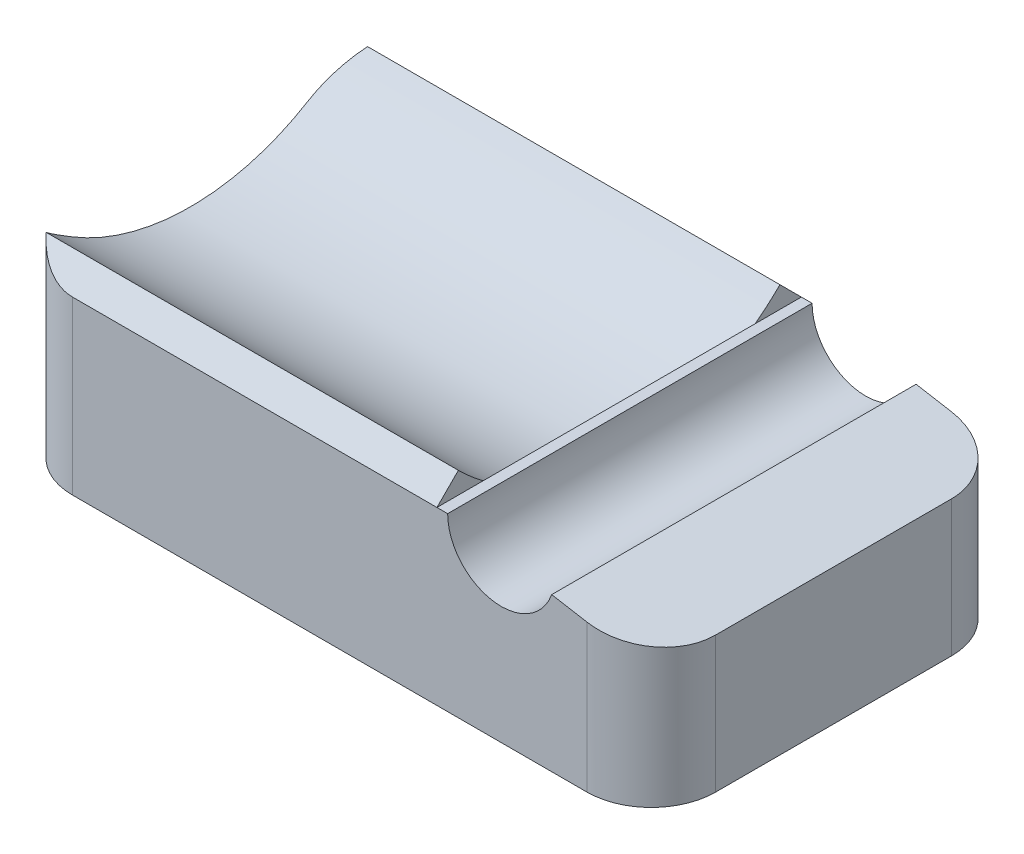
ISO-10303-21;
HEADER;
FILE_DESCRIPTION(('STEP AP214'),'2;1');
FILE_NAME('part.step','',(''),(''),'','','');
FILE_SCHEMA(('AUTOMOTIVE_DESIGN { 1 0 10303 214 1 1 1 1 }'));
ENDSEC;
DATA;
#1=APPLICATION_CONTEXT('core data for automotive mechanical design processes');
#2=APPLICATION_PROTOCOL_DEFINITION('international standard','automotive_design',2000,#1);
#3=PRODUCT_CONTEXT('',#1,'mechanical');
#4=PRODUCT('Part','Part','',(#3));
#5=PRODUCT_RELATED_PRODUCT_CATEGORY('part','',(#4));
#6=PRODUCT_DEFINITION_FORMATION('','',#4);
#7=PRODUCT_DEFINITION_CONTEXT('part definition',#1,'design');
#8=PRODUCT_DEFINITION('design','',#6,#7);
#9=PRODUCT_DEFINITION_SHAPE('','',#8);
#10=(LENGTH_UNIT() NAMED_UNIT(*) SI_UNIT(.MILLI.,.METRE.));
#11=(NAMED_UNIT(*) PLANE_ANGLE_UNIT() SI_UNIT($,.RADIAN.));
#12=(NAMED_UNIT(*) SI_UNIT($,.STERADIAN.) SOLID_ANGLE_UNIT());
#13=UNCERTAINTY_MEASURE_WITH_UNIT(LENGTH_MEASURE(1.E-05),#10,'distance_accuracy_value','');
#14=(GEOMETRIC_REPRESENTATION_CONTEXT(3) GLOBAL_UNCERTAINTY_ASSIGNED_CONTEXT((#13)) GLOBAL_UNIT_ASSIGNED_CONTEXT((#10,
#11,#12)) REPRESENTATION_CONTEXT('',''));
#15=CARTESIAN_POINT('',(0.,0.,0.));
#16=DIRECTION('',(0.,0.,1.));
#17=DIRECTION('',(1.,0.,0.));
#18=AXIS2_PLACEMENT_3D('',#15,#16,#17);
#19=CARTESIAN_POINT('',(0.,16.,0.));
#20=DIRECTION('',(0.,-1.,0.));
#21=DIRECTION('',(0.,0.,-1.));
#22=AXIS2_PLACEMENT_3D('',#19,#20,#21);
#23=PLANE('',#22);
#24=DIRECTION('',(1.,0.,0.));
#25=VECTOR('',#24,1.);
#26=CARTESIAN_POINT('',(0.,16.,0.));
#27=LINE('',#26,#25);
#28=CARTESIAN_POINT('',(40.,16.,0.));
#29=VERTEX_POINT('',#28);
#30=CARTESIAN_POINT('',(41.,16.,0.));
#31=VERTEX_POINT('',#30);
#32=EDGE_CURVE('E323',#29,#31,#27,.T.);
#33=ORIENTED_EDGE('',*,*,#32,.T.);
#34=DIRECTION('',(0.,0.,1.));
#35=VECTOR('',#34,1.);
#36=CARTESIAN_POINT('',(41.,16.,-34.));
#37=LINE('',#36,#35);
#38=CARTESIAN_POINT('',(41.,16.,-34.));
#39=VERTEX_POINT('',#38);
#40=EDGE_CURVE('E373',#31,#39,#37,.F.);
#41=ORIENTED_EDGE('',*,*,#40,.T.);
#42=DIRECTION('',(-1.,0.,0.));
#43=VECTOR('',#42,1.);
#44=CARTESIAN_POINT('',(0.,16.,-34.));
#45=LINE('',#44,#43);
#46=CARTESIAN_POINT('',(40.,16.,-34.));
#47=VERTEX_POINT('',#46);
#48=EDGE_CURVE('E169',#39,#47,#45,.T.);
#49=ORIENTED_EDGE('',*,*,#48,.T.);
#50=DIRECTION('',(0.,0.,1.));
#51=VECTOR('',#50,1.);
#52=CARTESIAN_POINT('',(40.,16.,-34.));
#53=LINE('',#52,#51);
#54=CARTESIAN_POINT('',(40.,16.,-29.6885775404495));
#55=VERTEX_POINT('',#54);
#56=EDGE_CURVE('E313',#47,#55,#53,.T.);
#57=ORIENTED_EDGE('',*,*,#56,.T.);
#58=DIRECTION('',(0.,0.,-1.));
#59=VECTOR('',#58,1.);
#60=CARTESIAN_POINT('',(40.,16.,0.));
#61=LINE('',#60,#59);
#62=CARTESIAN_POINT('',(40.,16.,-4.31142245955048));
#63=VERTEX_POINT('',#62);
#64=EDGE_CURVE('E352',#63,#55,#61,.T.);
#65=ORIENTED_EDGE('',*,*,#64,.F.);
#66=DIRECTION('',(0.,0.,1.));
#67=VECTOR('',#66,1.);
#68=CARTESIAN_POINT('',(40.,16.,0.));
#69=LINE('',#68,#67);
#70=EDGE_CURVE('E341',#63,#29,#69,.T.);
#71=ORIENTED_EDGE('',*,*,#70,.T.);
#72=EDGE_LOOP('',(#33,#41,#49,#57,#65,#71));
#73=FACE_BOUND('',#72,.T.);
#74=ADVANCED_FACE('F45',(#73),#23,.F.);
#75=CARTESIAN_POINT('',(0.,16.,0.));
#76=DIRECTION('',(1.,0.,0.));
#77=DIRECTION('',(0.,0.,-1.));
#78=AXIS2_PLACEMENT_3D('',#75,#76,#77);
#79=PLANE('',#78);
#80=CARTESIAN_POINT('',(0.,33.0000000000001,-17.));
#81=DIRECTION('',(1.,0.,0.));
#82=DIRECTION('',(0.,0.,1.));
#83=AXIS2_PLACEMENT_3D('',#80,#81,#82);
#84=CIRCLE('',#83,21.2132034355965);
#85=CARTESIAN_POINT('',(0.,14.861642852783,-6.));
#86=VERTEX_POINT('',#85);
#87=CARTESIAN_POINT('',(0.,14.861642852783,-28.));
#88=VERTEX_POINT('',#87);
#89=EDGE_CURVE('E303',#86,#88,#84,.T.);
#90=ORIENTED_EDGE('',*,*,#89,.T.);
#91=DIRECTION('',(0.,-1.,0.));
#92=VECTOR('',#91,1.);
#93=CARTESIAN_POINT('',(0.,16.,-28.));
#94=LINE('',#93,#92);
#95=CARTESIAN_POINT('',(0.,0.,-28.));
#96=VERTEX_POINT('',#95);
#97=EDGE_CURVE('E175',#88,#96,#94,.T.);
#98=ORIENTED_EDGE('',*,*,#97,.T.);
#99=DIRECTION('',(0.,0.,1.));
#100=VECTOR('',#99,1.);
#101=CARTESIAN_POINT('',(0.,0.,0.));
#102=LINE('',#101,#100);
#103=CARTESIAN_POINT('',(0.,0.,-6.));
#104=VERTEX_POINT('',#103);
#105=EDGE_CURVE('E319',#96,#104,#102,.T.);
#106=ORIENTED_EDGE('',*,*,#105,.T.);
#107=DIRECTION('',(0.,-1.,0.));
#108=VECTOR('',#107,1.);
#109=CARTESIAN_POINT('',(0.,16.,-6.));
#110=LINE('',#109,#108);
#111=EDGE_CURVE('E171',#104,#86,#110,.F.);
#112=ORIENTED_EDGE('',*,*,#111,.T.);
#113=EDGE_LOOP('',(#90,#98,#106,#112));
#114=FACE_BOUND('',#113,.T.);
#115=ADVANCED_FACE('F242',(#114),#79,.F.);
#116=CARTESIAN_POINT('',(0.,16.,0.));
#117=DIRECTION('',(0.,0.,-1.));
#118=DIRECTION('',(-1.,0.,0.));
#119=AXIS2_PLACEMENT_3D('',#116,#117,#118);
#120=PLANE('',#119);
#121=DIRECTION('',(0.,-1.,0.));
#122=VECTOR('',#121,1.);
#123=CARTESIAN_POINT('',(54.,16.,0.));
#124=LINE('',#123,#122);
#125=CARTESIAN_POINT('',(54.,0.,0.));
#126=VERTEX_POINT('',#125);
#127=CARTESIAN_POINT('',(54.,13.7371143827351,0.));
#128=VERTEX_POINT('',#127);
#129=EDGE_CURVE('E279',#126,#128,#124,.F.);
#130=ORIENTED_EDGE('',*,*,#129,.T.);
#131=DIRECTION('',(0.985185952673768,-0.171489470972069,0.));
#132=VECTOR('',#131,1.);
#133=CARTESIAN_POINT('',(50.7059136134572,14.3105098216686,0.));
#134=LINE('',#133,#132);
#135=CARTESIAN_POINT('',(50.7059136134572,14.3105098216686,0.));
#136=VERTEX_POINT('',#135);
#137=EDGE_CURVE('E61',#136,#128,#134,.T.);
#138=ORIENTED_EDGE('',*,*,#137,.F.);
#139=CARTESIAN_POINT('',(46.,16.,0.));
#140=DIRECTION('',(0.,0.,1.));
#141=DIRECTION('',(1.,0.,0.));
#142=AXIS2_PLACEMENT_3D('',#139,#140,#141);
#143=CIRCLE('',#142,5.);
#144=EDGE_CURVE('E162',#31,#136,#143,.T.);
#145=ORIENTED_EDGE('',*,*,#144,.F.);
#146=ORIENTED_EDGE('',*,*,#32,.F.);
#147=CARTESIAN_POINT('',(6.,16.,0.));
#148=VERTEX_POINT('',#147);
#149=EDGE_CURVE('E177',#148,#29,#27,.T.);
#150=ORIENTED_EDGE('',*,*,#149,.F.);
#151=DIRECTION('',(0.,-1.,0.));
#152=VECTOR('',#151,1.);
#153=CARTESIAN_POINT('',(6.,16.,0.));
#154=LINE('',#153,#152);
#155=CARTESIAN_POINT('',(6.,0.,0.));
#156=VERTEX_POINT('',#155);
#157=EDGE_CURVE('E287',#148,#156,#154,.T.);
#158=ORIENTED_EDGE('',*,*,#157,.T.);
#159=DIRECTION('',(1.,0.,0.));
#160=VECTOR('',#159,1.);
#161=CARTESIAN_POINT('',(0.,0.,0.));
#162=LINE('',#161,#160);
#163=EDGE_CURVE('E285',#156,#126,#162,.T.);
#164=ORIENTED_EDGE('',*,*,#163,.T.);
#165=EDGE_LOOP('',(#130,#138,#145,#146,#150,#158,#164));
#166=FACE_BOUND('',#165,.T.);
#167=ADVANCED_FACE('F252',(#166),#120,.F.);
#168=CARTESIAN_POINT('',(60.,16.,0.));
#169=DIRECTION('',(-1.,0.,0.));
#170=DIRECTION('',(0.,0.,1.));
#171=AXIS2_PLACEMENT_3D('',#168,#169,#170);
#172=PLANE('',#171);
#173=DIRECTION('',(0.,-1.,0.));
#174=VECTOR('',#173,1.);
#175=CARTESIAN_POINT('',(60.,16.,-28.));
#176=LINE('',#175,#174);
#177=CARTESIAN_POINT('',(60.,0.,-28.));
#178=VERTEX_POINT('',#177);
#179=CARTESIAN_POINT('',(60.,12.6927056363051,-28.));
#180=VERTEX_POINT('',#179);
#181=EDGE_CURVE('E291',#178,#180,#176,.F.);
#182=ORIENTED_EDGE('',*,*,#181,.T.);
#183=DIRECTION('',(0.,0.,1.));
#184=VECTOR('',#183,1.);
#185=CARTESIAN_POINT('',(60.,12.6927056363051,-34.));
#186=LINE('',#185,#184);
#187=CARTESIAN_POINT('',(60.,12.6927056363051,-6.));
#188=VERTEX_POINT('',#187);
#189=EDGE_CURVE('E164',#180,#188,#186,.T.);
#190=ORIENTED_EDGE('',*,*,#189,.T.);
#191=DIRECTION('',(0.,-1.,0.));
#192=VECTOR('',#191,1.);
#193=CARTESIAN_POINT('',(60.,16.,-6.));
#194=LINE('',#193,#192);
#195=CARTESIAN_POINT('',(60.,0.,-6.));
#196=VERTEX_POINT('',#195);
#197=EDGE_CURVE('E280',#188,#196,#194,.T.);
#198=ORIENTED_EDGE('',*,*,#197,.T.);
#199=DIRECTION('',(0.,0.,-1.));
#200=VECTOR('',#199,1.);
#201=CARTESIAN_POINT('',(60.,0.,0.));
#202=LINE('',#201,#200);
#203=EDGE_CURVE('E324',#196,#178,#202,.T.);
#204=ORIENTED_EDGE('',*,*,#203,.T.);
#205=EDGE_LOOP('',(#182,#190,#198,#204));
#206=FACE_BOUND('',#205,.T.);
#207=ADVANCED_FACE('F249',(#206),#172,.F.);
#208=CARTESIAN_POINT('',(0.,16.,-34.));
#209=DIRECTION('',(0.,0.,1.));
#210=DIRECTION('',(1.,0.,0.));
#211=AXIS2_PLACEMENT_3D('',#208,#209,#210);
#212=PLANE('',#211);
#213=CARTESIAN_POINT('',(46.,16.,-34.));
#214=DIRECTION('',(0.,0.,1.));
#215=DIRECTION('',(1.,0.,0.));
#216=AXIS2_PLACEMENT_3D('',#213,#214,#215);
#217=CIRCLE('',#216,5.);
#218=CARTESIAN_POINT('',(50.7059136134572,14.3105098216686,-34.));
#219=VERTEX_POINT('',#218);
#220=EDGE_CURVE('E159',#39,#219,#217,.T.);
#221=ORIENTED_EDGE('',*,*,#220,.T.);
#222=DIRECTION('',(0.985185952673768,-0.171489470972069,0.));
#223=VECTOR('',#222,1.);
#224=CARTESIAN_POINT('',(50.7059136134572,14.3105098216686,-34.));
#225=LINE('',#224,#223);
#226=CARTESIAN_POINT('',(54.,13.7371143827351,-34.));
#227=VERTEX_POINT('',#226);
#228=EDGE_CURVE('E145',#219,#227,#225,.T.);
#229=ORIENTED_EDGE('',*,*,#228,.T.);
#230=DIRECTION('',(0.,-1.,0.));
#231=VECTOR('',#230,1.);
#232=CARTESIAN_POINT('',(54.,16.,-34.));
#233=LINE('',#232,#231);
#234=CARTESIAN_POINT('',(54.,0.,-34.));
#235=VERTEX_POINT('',#234);
#236=EDGE_CURVE('E198',#227,#235,#233,.T.);
#237=ORIENTED_EDGE('',*,*,#236,.T.);
#238=DIRECTION('',(-1.,0.,0.));
#239=VECTOR('',#238,1.);
#240=CARTESIAN_POINT('',(0.,0.,-34.));
#241=LINE('',#240,#239);
#242=CARTESIAN_POINT('',(6.,0.,-34.));
#243=VERTEX_POINT('',#242);
#244=EDGE_CURVE('E180',#235,#243,#241,.T.);
#245=ORIENTED_EDGE('',*,*,#244,.T.);
#246=DIRECTION('',(0.,-1.,0.));
#247=VECTOR('',#246,1.);
#248=CARTESIAN_POINT('',(6.,16.,-34.));
#249=LINE('',#248,#247);
#250=CARTESIAN_POINT('',(6.,16.,-34.));
#251=VERTEX_POINT('',#250);
#252=EDGE_CURVE('E201',#243,#251,#249,.F.);
#253=ORIENTED_EDGE('',*,*,#252,.T.);
#254=DIRECTION('',(-1.,0.,0.));
#255=VECTOR('',#254,1.);
#256=CARTESIAN_POINT('',(40.,16.,-34.));
#257=LINE('',#256,#255);
#258=EDGE_CURVE('E335',#47,#251,#257,.T.);
#259=ORIENTED_EDGE('',*,*,#258,.F.);
#260=ORIENTED_EDGE('',*,*,#48,.F.);
#261=EDGE_LOOP('',(#221,#229,#237,#245,#253,#259,#260));
#262=FACE_BOUND('',#261,.T.);
#263=ADVANCED_FACE('F167',(#262),#212,.F.);
#264=CARTESIAN_POINT('',(0.,0.,0.));
#265=DIRECTION('',(0.,-1.,0.));
#266=DIRECTION('',(0.,0.,-1.));
#267=AXIS2_PLACEMENT_3D('',#264,#265,#266);
#268=PLANE('',#267);
#269=ORIENTED_EDGE('',*,*,#105,.F.);
#270=CARTESIAN_POINT('',(6.,0.,-28.));
#271=DIRECTION('',(0.,-1.,0.));
#272=DIRECTION('',(0.,0.,-1.));
#273=AXIS2_PLACEMENT_3D('',#270,#271,#272);
#274=CIRCLE('',#273,6.);
#275=EDGE_CURVE('E195',#96,#243,#274,.T.);
#276=ORIENTED_EDGE('',*,*,#275,.T.);
#277=ORIENTED_EDGE('',*,*,#244,.F.);
#278=CARTESIAN_POINT('',(54.,0.,-28.));
#279=DIRECTION('',(0.,-1.,0.));
#280=DIRECTION('',(0.,0.,-1.));
#281=AXIS2_PLACEMENT_3D('',#278,#279,#280);
#282=CIRCLE('',#281,6.);
#283=EDGE_CURVE('E192',#235,#178,#282,.T.);
#284=ORIENTED_EDGE('',*,*,#283,.T.);
#285=ORIENTED_EDGE('',*,*,#203,.F.);
#286=CARTESIAN_POINT('',(54.,0.,-6.));
#287=DIRECTION('',(0.,-1.,0.));
#288=DIRECTION('',(0.,0.,-1.));
#289=AXIS2_PLACEMENT_3D('',#286,#287,#288);
#290=CIRCLE('',#289,6.);
#291=EDGE_CURVE('E189',#196,#126,#290,.T.);
#292=ORIENTED_EDGE('',*,*,#291,.T.);
#293=ORIENTED_EDGE('',*,*,#163,.F.);
#294=CARTESIAN_POINT('',(6.,0.,-6.));
#295=DIRECTION('',(0.,-1.,0.));
#296=DIRECTION('',(0.,0.,-1.));
#297=AXIS2_PLACEMENT_3D('',#294,#295,#296);
#298=CIRCLE('',#297,6.);
#299=EDGE_CURVE('E186',#156,#104,#298,.T.);
#300=ORIENTED_EDGE('',*,*,#299,.T.);
#301=EDGE_LOOP('',(#269,#276,#277,#284,#285,#292,#293,#300));
#302=FACE_BOUND('',#301,.T.);
#303=ADVANCED_FACE('F236',(#302),#268,.T.);
#304=CARTESIAN_POINT('',(40.,18.,-1.99999999999999));
#305=DIRECTION('',(0.,0.707106781186546,0.707106781186549));
#306=DIRECTION('',(0.,-0.707106781186549,0.707106781186546));
#307=AXIS2_PLACEMENT_3D('',#304,#305,#306);
#308=PLANE('',#307);
#309=DIRECTION('',(-1.,0.,0.));
#310=VECTOR('',#309,1.);
#311=CARTESIAN_POINT('',(40.,18.,-1.99999999999999));
#312=LINE('',#311,#310);
#313=CARTESIAN_POINT('',(40.,18.,-1.99999999999999));
#314=VERTEX_POINT('',#313);
#315=CARTESIAN_POINT('',(1.52786404500042,18.,-1.99999999999999));
#316=VERTEX_POINT('',#315);
#317=EDGE_CURVE('E349',#314,#316,#312,.T.);
#318=ORIENTED_EDGE('',*,*,#317,.T.);
#319=CARTESIAN_POINT('',(6.,22.,-6.));
#320=DIRECTION('',(0.,0.707106781186546,0.707106781186549));
#321=DIRECTION('',(0.,-0.707106781186549,0.707106781186546));
#322=AXIS2_PLACEMENT_3D('',#319,#320,#321);
#323=ELLIPSE('',#322,8.48528137423859,6.);
#324=EDGE_CURVE('E55',#316,#148,#323,.T.);
#325=ORIENTED_EDGE('',*,*,#324,.T.);
#326=ORIENTED_EDGE('',*,*,#149,.T.);
#327=DIRECTION('',(0.,0.707106781186549,-0.707106781186546));
#328=VECTOR('',#327,1.);
#329=CARTESIAN_POINT('',(40.,18.,-1.99999999999999));
#330=LINE('',#329,#328);
#331=EDGE_CURVE('E345',#29,#314,#330,.T.);
#332=ORIENTED_EDGE('',*,*,#331,.T.);
#333=EDGE_LOOP('',(#318,#325,#326,#332));
#334=FACE_BOUND('',#333,.T.);
#335=ADVANCED_FACE('F231',(#334),#308,.T.);
#336=CARTESIAN_POINT('',(40.,33.0000000000001,-17.));
#337=DIRECTION('',(-1.,0.,0.));
#338=DIRECTION('',(0.,0.,1.));
#339=AXIS2_PLACEMENT_3D('',#336,#337,#338);
#340=PLANE('',#339);
#341=CARTESIAN_POINT('',(40.,33.0000000000001,-17.));
#342=DIRECTION('',(1.,0.,0.));
#343=DIRECTION('',(0.,0.,1.));
#344=AXIS2_PLACEMENT_3D('',#341,#342,#343);
#345=CIRCLE('',#344,21.2132034355965);
#346=EDGE_CURVE('E314',#314,#63,#345,.T.);
#347=ORIENTED_EDGE('',*,*,#346,.F.);
#348=ORIENTED_EDGE('',*,*,#331,.F.);
#349=ORIENTED_EDGE('',*,*,#70,.F.);
#350=EDGE_LOOP('',(#347,#348,#349));
#351=FACE_BOUND('',#350,.T.);
#352=ADVANCED_FACE('F235',(#351),#340,.F.);
#353=CARTESIAN_POINT('',(40.,16.,-34.));
#354=DIRECTION('',(0.,0.707106781186546,-0.707106781186549));
#355=DIRECTION('',(0.,0.707106781186549,0.707106781186546));
#356=AXIS2_PLACEMENT_3D('',#353,#354,#355);
#357=PLANE('',#356);
#358=ORIENTED_EDGE('',*,*,#258,.T.);
#359=CARTESIAN_POINT('',(6.,22.,-28.));
#360=DIRECTION('',(0.,0.707106781186546,-0.707106781186549));
#361=DIRECTION('',(0.,-0.707106781186549,-0.707106781186546));
#362=AXIS2_PLACEMENT_3D('',#359,#360,#361);
#363=ELLIPSE('',#362,8.48528137423859,6.);
#364=CARTESIAN_POINT('',(1.52786404500042,18.,-32.));
#365=VERTEX_POINT('',#364);
#366=EDGE_CURVE('E204',#251,#365,#363,.T.);
#367=ORIENTED_EDGE('',*,*,#366,.T.);
#368=DIRECTION('',(-1.,0.,0.));
#369=VECTOR('',#368,1.);
#370=CARTESIAN_POINT('',(40.,18.,-32.));
#371=LINE('',#370,#369);
#372=CARTESIAN_POINT('',(40.,18.,-32.));
#373=VERTEX_POINT('',#372);
#374=EDGE_CURVE('E306',#373,#365,#371,.T.);
#375=ORIENTED_EDGE('',*,*,#374,.F.);
#376=DIRECTION('',(0.,-0.707106781186549,-0.707106781186546));
#377=VECTOR('',#376,1.);
#378=CARTESIAN_POINT('',(40.,16.,-34.));
#379=LINE('',#378,#377);
#380=EDGE_CURVE('E355',#373,#47,#379,.T.);
#381=ORIENTED_EDGE('',*,*,#380,.T.);
#382=EDGE_LOOP('',(#358,#367,#375,#381));
#383=FACE_BOUND('',#382,.T.);
#384=ADVANCED_FACE('F228',(#383),#357,.T.);
#385=CARTESIAN_POINT('',(40.,33.0000000000001,-17.));
#386=DIRECTION('',(-1.,0.,0.));
#387=DIRECTION('',(0.,0.,1.));
#388=AXIS2_PLACEMENT_3D('',#385,#386,#387);
#389=CYLINDRICAL_SURFACE('',#388,21.2132034355965);
#390=ORIENTED_EDGE('',*,*,#374,.T.);
#391=CARTESIAN_POINT('',(1.52786404500042,18.,-32.));
#392=CARTESIAN_POINT('',(1.45900578767076,17.9230052664998,-31.9230070272948));
#393=CARTESIAN_POINT('',(1.3923238910591,17.8456466655275,-31.8444607934481));
#394=CARTESIAN_POINT('',(1.26331157672723,17.6904421594133,-31.6843406708876));
#395=CARTESIAN_POINT('',(1.20098101553311,17.6125962704307,-31.6027668821355));
#396=CARTESIAN_POINT('',(1.02048375062399,17.3786493614459,-31.3535813984064));
#397=CARTESIAN_POINT('',(0.908839073042235,17.2221701624675,-31.1815365185059));
#398=CARTESIAN_POINT('',(0.70601552313539,16.9139587451333,-30.8308492142486));
#399=CARTESIAN_POINT('',(0.614393378771985,16.7622059437931,-30.6524806937828));
#400=CARTESIAN_POINT('',(0.448899484701777,16.4609866933311,-30.2859843527872));
#401=CARTESIAN_POINT('',(0.37502344774007,16.3115197001711,-30.0978589027999));
#402=CARTESIAN_POINT('',(0.21149077689632,15.937164928387,-29.6094396879001));
#403=CARTESIAN_POINT('',(0.134471290047688,15.7146209126178,-29.3028900371594));
#404=CARTESIAN_POINT('',(0.0550703678495283,15.3888081692823,-28.8272571722533));
#405=CARTESIAN_POINT('',(0.0346086753936515,15.2805284645046,-28.6644197823296));
#406=CARTESIAN_POINT('',(0.00707378503095877,15.0679462735669,-28.3349007858483));
#407=CARTESIAN_POINT('',(1.02288281882711E-05,14.9636467044814,-28.1682164981886));
#408=CARTESIAN_POINT('',(0.,14.861642852783,-28.));
#409=B_SPLINE_CURVE_WITH_KNOTS('',3,(#391,#392,#393,#394,#395,#396,#397,#398,#399,#400,#401,
#402,#403,#404,#405,#406,#407,#408),.UNSPECIFIED.,.F.,.F.,(4,2,2,2,2,2,2,2,4),(0.,
0.386433148044119,0.772853548442102,1.54584929607755,2.29944713677546,3.05286273340987,
4.20857588513662,4.79797677677301,5.38780165843418),.UNSPECIFIED.);
#410=EDGE_CURVE('E215',#365,#88,#409,.T.);
#411=ORIENTED_EDGE('',*,*,#410,.T.);
#412=ORIENTED_EDGE('',*,*,#89,.F.);
#413=CARTESIAN_POINT('',(0.,14.861642852783,-6.));
#414=CARTESIAN_POINT('',(1.65452733558237E-06,14.9288518247416,-5.88917253595609));
#415=CARTESIAN_POINT('',(0.00307075278890703,14.9970654605484,-5.77898770790247));
#416=CARTESIAN_POINT('',(0.0151413992329658,15.1353363448768,-5.56013411500343));
#417=CARTESIAN_POINT('',(0.0241419481283194,15.2053932809443,-5.45146509793391));
#418=CARTESIAN_POINT('',(0.0597104701272199,15.4179456487026,-5.12827969048694));
#419=CARTESIAN_POINT('',(0.0948463032499912,15.5629839216223,-4.91631920459186));
#420=CARTESIAN_POINT('',(0.185273303818967,15.8546834657305,-4.5060017651759));
#421=CARTESIAN_POINT('',(0.24005073007314,16.0012183746815,-4.30743892483354));
#422=CARTESIAN_POINT('',(0.368585471647669,16.2979867015351,-3.91938855991628));
#423=CARTESIAN_POINT('',(0.4423447716074,16.4482205046872,-3.7299019867642));
#424=CARTESIAN_POINT('',(0.587788041569398,16.7143586402406,-3.40549124924453));
#425=CARTESIAN_POINT('',(0.655666285735983,16.8297857419578,-3.26844717785986));
#426=CARTESIAN_POINT('',(0.80138051571434,17.0612896219892,-3.00039780252745));
#427=CARTESIAN_POINT('',(0.879213813022806,17.1773662168349,-2.86939088110815));
#428=CARTESIAN_POINT('',(1.046187854511,17.4117397420496,-2.61121667677036));
#429=CARTESIAN_POINT('',(1.13551650002204,17.5300366487985,-2.48417086715488));
#430=CARTESIAN_POINT('',(1.32419882870964,17.7658322095239,-2.23688907475136));
#431=CARTESIAN_POINT('',(1.42355513535939,17.8833306459751,-2.11665488695746));
#432=CARTESIAN_POINT('',(1.52786404500043,18.,-1.99999999999999));
#433=B_SPLINE_CURVE_WITH_KNOTS('',3,(#413,#414,#415,#416,#417,#418,#419,#420,#421,#422,#423,
#424,#425,#426,#427,#428,#429,#430,#431,#432),.UNSPECIFIED.,.F.,.F.,(4,2,2,2,2,2,2,2,2,4),(0.,
0.388748491874645,0.777431507002802,1.55386894446666,2.31132465264379,3.06885958838421,
3.64333450406555,4.21765460094595,4.80296650984076,5.38843194908453),.UNSPECIFIED.);
#434=EDGE_CURVE('E207',#86,#316,#433,.T.);
#435=ORIENTED_EDGE('',*,*,#434,.T.);
#436=ORIENTED_EDGE('',*,*,#317,.F.);
#437=ORIENTED_EDGE('',*,*,#346,.T.);
#438=CARTESIAN_POINT('',(40.,33.0000000000001,-17.));
#439=DIRECTION('',(-1.,0.,0.));
#440=DIRECTION('',(0.,0.,1.));
#441=AXIS2_PLACEMENT_3D('',#438,#439,#440);
#442=CIRCLE('',#441,21.2132034355965);
#443=EDGE_CURVE('E369',#63,#55,#442,.F.);
#444=ORIENTED_EDGE('',*,*,#443,.T.);
#445=CARTESIAN_POINT('',(40.,33.0000000000001,-17.));
#446=DIRECTION('',(1.,0.,0.));
#447=DIRECTION('',(0.,0.,1.));
#448=AXIS2_PLACEMENT_3D('',#445,#446,#447);
#449=CIRCLE('',#448,21.2132034355965);
#450=EDGE_CURVE('E361',#55,#373,#449,.T.);
#451=ORIENTED_EDGE('',*,*,#450,.T.);
#452=EDGE_LOOP('',(#390,#411,#412,#435,#436,#437,#444,#451));
#453=FACE_BOUND('',#452,.T.);
#454=ADVANCED_FACE('F222',(#453),#389,.F.);
#455=CARTESIAN_POINT('',(40.,33.0000000000001,-17.));
#456=DIRECTION('',(-1.,0.,0.));
#457=DIRECTION('',(0.,0.,1.));
#458=AXIS2_PLACEMENT_3D('',#455,#456,#457);
#459=PLANE('',#458);
#460=ORIENTED_EDGE('',*,*,#56,.F.);
#461=ORIENTED_EDGE('',*,*,#380,.F.);
#462=ORIENTED_EDGE('',*,*,#450,.F.);
#463=EDGE_LOOP('',(#460,#461,#462));
#464=FACE_BOUND('',#463,.T.);
#465=ADVANCED_FACE('F227',(#464),#459,.F.);
#466=CARTESIAN_POINT('',(40.,33.0000000000001,-17.));
#467=DIRECTION('',(-1.,0.,0.));
#468=DIRECTION('',(0.,0.,1.));
#469=AXIS2_PLACEMENT_3D('',#466,#467,#468);
#470=PLANE('',#469);
#471=ORIENTED_EDGE('',*,*,#64,.T.);
#472=ORIENTED_EDGE('',*,*,#443,.F.);
#473=EDGE_LOOP('',(#471,#472));
#474=FACE_BOUND('',#473,.T.);
#475=ADVANCED_FACE('F391',(#474),#470,.T.);
#476=CARTESIAN_POINT('',(46.,16.,-34.));
#477=DIRECTION('',(0.,0.,1.));
#478=DIRECTION('',(1.,0.,0.));
#479=AXIS2_PLACEMENT_3D('',#476,#477,#478);
#480=CYLINDRICAL_SURFACE('',#479,5.);
#481=ORIENTED_EDGE('',*,*,#144,.T.);
#482=DIRECTION('',(0.,0.,1.));
#483=VECTOR('',#482,1.);
#484=CARTESIAN_POINT('',(50.7059136134572,14.3105098216686,-34.));
#485=LINE('',#484,#483);
#486=EDGE_CURVE('E148',#219,#136,#485,.T.);
#487=ORIENTED_EDGE('',*,*,#486,.F.);
#488=ORIENTED_EDGE('',*,*,#220,.F.);
#489=ORIENTED_EDGE('',*,*,#40,.F.);
#490=EDGE_LOOP('',(#481,#487,#488,#489));
#491=FACE_BOUND('',#490,.T.);
#492=ADVANCED_FACE('F158',(#491),#480,.F.);
#493=CARTESIAN_POINT('',(6.,16.,-28.));
#494=DIRECTION('',(0.,-1.,0.));
#495=DIRECTION('',(0.,0.,-1.));
#496=AXIS2_PLACEMENT_3D('',#493,#494,#495);
#497=CYLINDRICAL_SURFACE('',#496,6.);
#498=ORIENTED_EDGE('',*,*,#366,.F.);
#499=ORIENTED_EDGE('',*,*,#252,.F.);
#500=ORIENTED_EDGE('',*,*,#275,.F.);
#501=ORIENTED_EDGE('',*,*,#97,.F.);
#502=ORIENTED_EDGE('',*,*,#410,.F.);
#503=EDGE_LOOP('',(#498,#499,#500,#501,#502));
#504=FACE_BOUND('',#503,.T.);
#505=ADVANCED_FACE('F259',(#504),#497,.T.);
#506=CARTESIAN_POINT('',(54.,16.,-28.));
#507=DIRECTION('',(0.,-1.,0.));
#508=DIRECTION('',(0.,0.,-1.));
#509=AXIS2_PLACEMENT_3D('',#506,#507,#508);
#510=CYLINDRICAL_SURFACE('',#509,6.);
#511=CARTESIAN_POINT('',(54.,13.7371143827351,-28.));
#512=DIRECTION('',(-0.171489470972069,-0.985185952673768,0.));
#513=DIRECTION('',(0.985185952673768,-0.171489470972069,0.));
#514=AXIS2_PLACEMENT_3D('',#511,#512,#513);
#515=ELLIPSE('',#514,6.09022081944648,6.);
#516=EDGE_CURVE('E150',#180,#227,#515,.F.);
#517=ORIENTED_EDGE('',*,*,#516,.F.);
#518=ORIENTED_EDGE('',*,*,#181,.F.);
#519=ORIENTED_EDGE('',*,*,#283,.F.);
#520=ORIENTED_EDGE('',*,*,#236,.F.);
#521=EDGE_LOOP('',(#517,#518,#519,#520));
#522=FACE_BOUND('',#521,.T.);
#523=ADVANCED_FACE('F263',(#522),#510,.T.);
#524=CARTESIAN_POINT('',(54.,16.,-6.));
#525=DIRECTION('',(0.,-1.,0.));
#526=DIRECTION('',(0.,0.,-1.));
#527=AXIS2_PLACEMENT_3D('',#524,#525,#526);
#528=CYLINDRICAL_SURFACE('',#527,6.);
#529=CARTESIAN_POINT('',(54.,13.7371143827351,-6.));
#530=DIRECTION('',(-0.171489470972069,-0.985185952673768,0.));
#531=DIRECTION('',(0.985185952673768,-0.171489470972069,0.));
#532=AXIS2_PLACEMENT_3D('',#529,#530,#531);
#533=ELLIPSE('',#532,6.09022081944648,6.);
#534=EDGE_CURVE('E11',#128,#188,#533,.F.);
#535=ORIENTED_EDGE('',*,*,#534,.F.);
#536=ORIENTED_EDGE('',*,*,#129,.F.);
#537=ORIENTED_EDGE('',*,*,#291,.F.);
#538=ORIENTED_EDGE('',*,*,#197,.F.);
#539=EDGE_LOOP('',(#535,#536,#537,#538));
#540=FACE_BOUND('',#539,.T.);
#541=ADVANCED_FACE('F266',(#540),#528,.T.);
#542=CARTESIAN_POINT('',(6.,16.,-6.));
#543=DIRECTION('',(0.,-1.,0.));
#544=DIRECTION('',(0.,0.,-1.));
#545=AXIS2_PLACEMENT_3D('',#542,#543,#544);
#546=CYLINDRICAL_SURFACE('',#545,6.);
#547=ORIENTED_EDGE('',*,*,#434,.F.);
#548=ORIENTED_EDGE('',*,*,#111,.F.);
#549=ORIENTED_EDGE('',*,*,#299,.F.);
#550=ORIENTED_EDGE('',*,*,#157,.F.);
#551=ORIENTED_EDGE('',*,*,#324,.F.);
#552=EDGE_LOOP('',(#547,#548,#549,#550,#551));
#553=FACE_BOUND('',#552,.T.);
#554=ADVANCED_FACE('F47',(#553),#546,.T.);
#555=CARTESIAN_POINT('',(50.7059136134572,14.3105098216686,-34.));
#556=DIRECTION('',(-0.171489470972069,-0.985185952673768,0.));
#557=DIRECTION('',(0.985185952673768,-0.171489470972069,0.));
#558=AXIS2_PLACEMENT_3D('',#555,#556,#557);
#559=PLANE('',#558);
#560=ORIENTED_EDGE('',*,*,#516,.T.);
#561=ORIENTED_EDGE('',*,*,#228,.F.);
#562=ORIENTED_EDGE('',*,*,#486,.T.);
#563=ORIENTED_EDGE('',*,*,#137,.T.);
#564=ORIENTED_EDGE('',*,*,#534,.T.);
#565=ORIENTED_EDGE('',*,*,#189,.F.);
#566=EDGE_LOOP('',(#560,#561,#562,#563,#564,#565));
#567=FACE_BOUND('',#566,.T.);
#568=ADVANCED_FACE('F147',(#567),#559,.F.);
#569=CLOSED_SHELL('',(#74,#115,#167,#207,#263,#303,#335,#352,#384,#454,#465,#475,#492,#505,#523,
#541,#554,#568));
#570=MANIFOLD_SOLID_BREP('B2',#569);
#571=ADVANCED_BREP_SHAPE_REPRESENTATION('',(#18,#570),#14);
#572=SHAPE_DEFINITION_REPRESENTATION(#9,#571);
ENDSEC;
END-ISO-10303-21;
